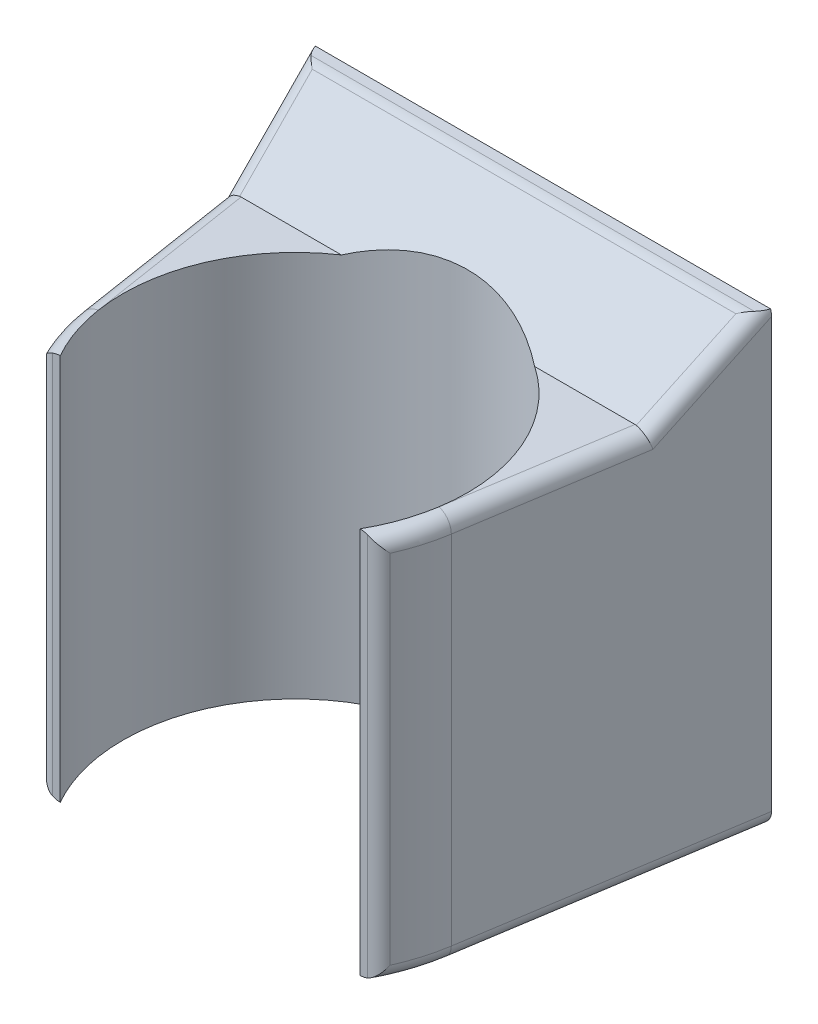
ISO-10303-21;
HEADER;
FILE_DESCRIPTION(('STEP AP214'),'2;1');
FILE_NAME('part.step','',(''),(''),'','','');
FILE_SCHEMA(('AUTOMOTIVE_DESIGN { 1 0 10303 214 1 1 1 1 }'));
ENDSEC;
DATA;
#1=APPLICATION_CONTEXT('core data for automotive mechanical design processes');
#2=APPLICATION_PROTOCOL_DEFINITION('international standard','automotive_design',2000,#1);
#3=PRODUCT_CONTEXT('',#1,'mechanical');
#4=PRODUCT('Part','Part','',(#3));
#5=PRODUCT_RELATED_PRODUCT_CATEGORY('part','',(#4));
#6=PRODUCT_DEFINITION_FORMATION('','',#4);
#7=PRODUCT_DEFINITION_CONTEXT('part definition',#1,'design');
#8=PRODUCT_DEFINITION('design','',#6,#7);
#9=PRODUCT_DEFINITION_SHAPE('','',#8);
#10=(LENGTH_UNIT() NAMED_UNIT(*) SI_UNIT(.MILLI.,.METRE.));
#11=(NAMED_UNIT(*) PLANE_ANGLE_UNIT() SI_UNIT($,.RADIAN.));
#12=(NAMED_UNIT(*) SI_UNIT($,.STERADIAN.) SOLID_ANGLE_UNIT());
#13=UNCERTAINTY_MEASURE_WITH_UNIT(LENGTH_MEASURE(1.E-05),#10,'distance_accuracy_value','');
#14=(GEOMETRIC_REPRESENTATION_CONTEXT(3) GLOBAL_UNCERTAINTY_ASSIGNED_CONTEXT((#13)) GLOBAL_UNIT_ASSIGNED_CONTEXT((#10,
#11,#12)) REPRESENTATION_CONTEXT('',''));
#15=CARTESIAN_POINT('',(0.,0.,0.));
#16=DIRECTION('',(0.,0.,1.));
#17=DIRECTION('',(1.,0.,0.));
#18=AXIS2_PLACEMENT_3D('',#15,#16,#17);
#19=CARTESIAN_POINT('',(11.13552872566,30.,5.67890834580027));
#20=DIRECTION('',(0.,0.,-1.));
#21=DIRECTION('',(-1.,0.,0.));
#22=AXIS2_PLACEMENT_3D('',#19,#20,#21);
#23=PLANE('',#22);
#24=DIRECTION('',(0.,-1.,0.));
#25=VECTOR('',#24,1.);
#26=CARTESIAN_POINT('',(-10.5051328735814,30.,5.67890834580027));
#27=LINE('',#26,#25);
#28=CARTESIAN_POINT('',(-10.5051328735814,25.6970882189264,5.67890834580027));
#29=VERTEX_POINT('',#28);
#30=CARTESIAN_POINT('',(-10.5051328735814,0.102911781073564,5.67890834580027));
#31=VERTEX_POINT('',#30);
#32=EDGE_CURVE('E375',#29,#31,#27,.T.);
#33=ORIENTED_EDGE('',*,*,#32,.T.);
#34=CARTESIAN_POINT('',(-10.5051328735814,0.102911781073565,5.67890834580027));
#35=CARTESIAN_POINT('',(-10.4390562772163,0.0742564835110553,5.67890834580027));
#36=CARTESIAN_POINT('',(-10.3704496172207,0.0516304222241475,5.67890834580027));
#37=CARTESIAN_POINT('',(-10.2315364640359,0.0185988964917889,5.67890834580027));
#38=CARTESIAN_POINT('',(-10.1612766962828,0.00799795207087063,5.67890834580027));
#39=CARTESIAN_POINT('',(-10.0604898680895,0.00103474183191721,5.67890834580027));
#40=CARTESIAN_POINT('',(-10.0302342968207,-4.14489225278887E-06,5.67890834580027));
#41=CARTESIAN_POINT('',(-10.,0.,5.67890834580027));
#42=B_SPLINE_CURVE_WITH_KNOTS('',3,(#34,#35,#36,#37,#38,#39,#40,#41),.UNSPECIFIED.,.F.,.F.,(4,2,
2,4),(0.,0.215695155836073,0.427831340232889,0.518569670833685),.UNSPECIFIED.);
#43=CARTESIAN_POINT('',(-10.,0.,5.67890834580027));
#44=VERTEX_POINT('',#43);
#45=EDGE_CURVE('E244',#31,#44,#42,.T.);
#46=ORIENTED_EDGE('',*,*,#45,.T.);
#47=DIRECTION('',(0.,1.,0.));
#48=VECTOR('',#47,1.);
#49=CARTESIAN_POINT('',(-10.,0.,5.67890834580027));
#50=LINE('',#49,#48);
#51=CARTESIAN_POINT('',(-10.,25.8,5.67890834580027));
#52=VERTEX_POINT('',#51);
#53=EDGE_CURVE('E197',#44,#52,#50,.T.);
#54=ORIENTED_EDGE('',*,*,#53,.T.);
#55=CARTESIAN_POINT('',(-10.,25.8,5.67890834580027));
#56=CARTESIAN_POINT('',(-10.0719015065059,25.8000447911978,5.67890834580027));
#57=CARTESIAN_POINT('',(-10.143973880234,25.7941358505785,5.67890834580027));
#58=CARTESIAN_POINT('',(-10.2848892497754,25.7706065708585,5.67890834580027));
#59=CARTESIAN_POINT('',(-10.3537664870802,25.7531897038123,5.67890834580027));
#60=CARTESIAN_POINT('',(-10.4348306022066,25.725063612592,5.67890834580027));
#61=CARTESIAN_POINT('',(-10.4490047399151,25.7198499770122,5.67890834580027));
#62=CARTESIAN_POINT('',(-10.4772008705726,25.7088765708328,5.67890834580027));
#63=CARTESIAN_POINT('',(-10.4912220987829,25.7031148356164,5.67890834580027));
#64=CARTESIAN_POINT('',(-10.5051328735814,25.6970882189264,5.67890834580027));
#65=B_SPLINE_CURVE_WITH_KNOTS('',3,(#55,#56,#57,#58,#59,#60,#61,#62,#63,#64),.UNSPECIFIED.,.F.,
.F.,(4,2,2,2,4),(0.,0.215773371607439,0.427830227453304,0.473131172926107,0.518601097155922),.UNSPECIFIED.);
#66=EDGE_CURVE('E235',#52,#29,#65,.T.);
#67=ORIENTED_EDGE('',*,*,#66,.T.);
#68=EDGE_LOOP('',(#33,#46,#54,#67));
#69=FACE_BOUND('',#68,.T.);
#70=ADVANCED_FACE('F37',(#69),#23,.F.);
#71=CARTESIAN_POINT('',(0.,25.8,0.));
#72=DIRECTION('',(0.,1.,0.));
#73=DIRECTION('',(0.,0.,1.));
#74=AXIS2_PLACEMENT_3D('',#71,#72,#73);
#75=PLANE('',#74);
#76=CARTESIAN_POINT('',(0.,25.8,0.));
#77=DIRECTION('',(0.,1.,0.));
#78=DIRECTION('',(0.,0.,1.));
#79=AXIS2_PLACEMENT_3D('',#76,#77,#78);
#80=CIRCLE('',#79,11.5);
#81=CARTESIAN_POINT('',(11.3605460844121,25.8,1.78549507530793));
#82=VERTEX_POINT('',#81);
#83=CARTESIAN_POINT('',(6.44708821640747,25.8,-9.52287002588295));
#84=VERTEX_POINT('',#83);
#85=EDGE_CURVE('E344',#82,#84,#80,.T.);
#86=ORIENTED_EDGE('',*,*,#85,.F.);
#87=DIRECTION('',(0.155260441331124,0.,-0.987873572557574));
#88=VECTOR('',#87,1.);
#89=CARTESIAN_POINT('',(13.1622417774943,25.8,-9.67813046721408));
#90=LINE('',#89,#88);
#91=CARTESIAN_POINT('',(13.1378400672836,25.8,-9.52287002588295));
#92=VERTEX_POINT('',#91);
#93=EDGE_CURVE('E204',#82,#92,#90,.T.);
#94=ORIENTED_EDGE('',*,*,#93,.T.);
#95=DIRECTION('',(-1.,0.,0.));
#96=VECTOR('',#95,1.);
#97=CARTESIAN_POINT('',(-14.1498358499417,25.8,-9.52287002588295));
#98=LINE('',#97,#96);
#99=EDGE_CURVE('E365',#92,#84,#98,.T.);
#100=ORIENTED_EDGE('',*,*,#99,.T.);
#101=EDGE_LOOP('',(#86,#94,#100));
#102=FACE_BOUND('',#101,.T.);
#103=ADVANCED_FACE('F420',(#102),#75,.T.);
#104=CARTESIAN_POINT('',(0.,30.,0.));
#105=DIRECTION('',(0.,-1.,0.));
#106=DIRECTION('',(0.,0.,-1.));
#107=AXIS2_PLACEMENT_3D('',#104,#105,#106);
#108=CYLINDRICAL_SURFACE('',#107,12.5);
#109=DIRECTION('',(0.,-1.,0.));
#110=VECTOR('',#109,1.);
#111=CARTESIAN_POINT('',(-12.3484196569697,30.,1.94075551663905));
#112=LINE('',#111,#110);
#113=CARTESIAN_POINT('',(-12.3484196569697,24.8,1.94075551663905));
#114=VERTEX_POINT('',#113);
#115=CARTESIAN_POINT('',(-12.3484196569697,1.,1.94075551663905));
#116=VERTEX_POINT('',#115);
#117=EDGE_CURVE('E361',#114,#116,#112,.T.);
#118=ORIENTED_EDGE('',*,*,#117,.T.);
#119=CARTESIAN_POINT('',(0.,1.,0.));
#120=DIRECTION('',(0.,1.,0.));
#121=DIRECTION('',(0.,0.,1.));
#122=AXIS2_PLACEMENT_3D('',#119,#120,#121);
#123=CIRCLE('',#122,12.5);
#124=CARTESIAN_POINT('',(-11.4186226886754,1.,5.08576994108725));
#125=VERTEX_POINT('',#124);
#126=EDGE_CURVE('E373',#116,#125,#123,.T.);
#127=ORIENTED_EDGE('',*,*,#126,.T.);
#128=DIRECTION('',(0.,-1.,0.));
#129=VECTOR('',#128,1.);
#130=CARTESIAN_POINT('',(-11.4186226886754,30.,5.08576994108725));
#131=LINE('',#130,#129);
#132=CARTESIAN_POINT('',(-11.4186226886754,24.8,5.08576994108725));
#133=VERTEX_POINT('',#132);
#134=EDGE_CURVE('E369',#125,#133,#131,.F.);
#135=ORIENTED_EDGE('',*,*,#134,.T.);
#136=CARTESIAN_POINT('',(0.,24.8,0.));
#137=DIRECTION('',(0.,1.,0.));
#138=DIRECTION('',(0.,0.,1.));
#139=AXIS2_PLACEMENT_3D('',#136,#137,#138);
#140=CIRCLE('',#139,12.5);
#141=EDGE_CURVE('E371',#133,#114,#140,.F.);
#142=ORIENTED_EDGE('',*,*,#141,.T.);
#143=EDGE_LOOP('',(#118,#127,#135,#142));
#144=FACE_BOUND('',#143,.T.);
#145=ADVANCED_FACE('F229',(#144),#108,.T.);
#146=DIRECTION('',(0.,1.,0.));
#147=VECTOR('',#146,1.);
#148=CARTESIAN_POINT('',(10.,0.,5.67890834580027));
#149=LINE('',#148,#147);
#150=CARTESIAN_POINT('',(10.,0.,5.67890834580027));
#151=VERTEX_POINT('',#150);
#152=CARTESIAN_POINT('',(10.,25.8,5.67890834580027));
#153=VERTEX_POINT('',#152);
#154=EDGE_CURVE('E181',#151,#153,#149,.T.);
#155=ORIENTED_EDGE('',*,*,#154,.F.);
#156=CARTESIAN_POINT('',(10.,0.,5.67890834580027));
#157=CARTESIAN_POINT('',(10.0719015065059,-4.47911978014021E-05,5.67890834580027));
#158=CARTESIAN_POINT('',(10.143973880234,0.00586414942147235,5.67890834580027));
#159=CARTESIAN_POINT('',(10.2848892497754,0.0293934291414904,5.67890834580027));
#160=CARTESIAN_POINT('',(10.3537664870802,0.0468102961877393,5.67890834580027));
#161=CARTESIAN_POINT('',(10.4348306022066,0.0749363874080327,5.67890834580027));
#162=CARTESIAN_POINT('',(10.4490047399151,0.080150022987751,5.67890834580027));
#163=CARTESIAN_POINT('',(10.4772008705726,0.0911234291672142,5.67890834580027));
#164=CARTESIAN_POINT('',(10.4912220987829,0.0968851643835558,5.67890834580027));
#165=CARTESIAN_POINT('',(10.5051328735814,0.102911781073566,5.67890834580027));
#166=B_SPLINE_CURVE_WITH_KNOTS('',3,(#156,#157,#158,#159,#160,#161,#162,#163,#164,#165),
.UNSPECIFIED.,.F.,.F.,(4,2,2,2,4),(0.,0.215773371607442,0.427830227453304,0.473131172926107,
0.518601097155923),.UNSPECIFIED.);
#167=CARTESIAN_POINT('',(10.5051328735814,0.102911781073564,5.67890834580027));
#168=VERTEX_POINT('',#167);
#169=EDGE_CURVE('E193',#151,#168,#166,.T.);
#170=ORIENTED_EDGE('',*,*,#169,.T.);
#171=DIRECTION('',(0.,-1.,0.));
#172=VECTOR('',#171,1.);
#173=CARTESIAN_POINT('',(10.5051328735814,30.,5.67890834580027));
#174=LINE('',#173,#172);
#175=CARTESIAN_POINT('',(10.5051328735814,25.6970882189264,5.67890834580027));
#176=VERTEX_POINT('',#175);
#177=EDGE_CURVE('E208',#168,#176,#174,.F.);
#178=ORIENTED_EDGE('',*,*,#177,.T.);
#179=CARTESIAN_POINT('',(10.5051328735814,25.6970882189264,5.67890834580027));
#180=CARTESIAN_POINT('',(10.4390562772163,25.7257435164889,5.67890834580027));
#181=CARTESIAN_POINT('',(10.3704496172207,25.7483695777759,5.67890834580027));
#182=CARTESIAN_POINT('',(10.2315364640359,25.7814011035082,5.67890834580027));
#183=CARTESIAN_POINT('',(10.1612766962828,25.7920020479291,5.67890834580027));
#184=CARTESIAN_POINT('',(10.0604898680895,25.7989652581681,5.67890834580027));
#185=CARTESIAN_POINT('',(10.0302342968207,25.8000041448923,5.67890834580027));
#186=CARTESIAN_POINT('',(10.,25.8,5.67890834580027));
#187=B_SPLINE_CURVE_WITH_KNOTS('',3,(#179,#180,#181,#182,#183,#184,#185,#186),.UNSPECIFIED.,.F.,
.F.,(4,2,2,4),(0.,0.215695155836076,0.427831340232892,0.518569670833681),.UNSPECIFIED.);
#188=EDGE_CURVE('E196',#176,#153,#187,.T.);
#189=ORIENTED_EDGE('',*,*,#188,.T.);
#190=EDGE_LOOP('',(#155,#170,#178,#189));
#191=FACE_BOUND('',#190,.T.);
#192=ADVANCED_FACE('F192',(#191),#23,.F.);
#193=CARTESIAN_POINT('',(0.,30.,0.));
#194=DIRECTION('',(0.,-1.,0.));
#195=DIRECTION('',(0.,0.,-1.));
#196=AXIS2_PLACEMENT_3D('',#193,#194,#195);
#197=CYLINDRICAL_SURFACE('',#196,12.5);
#198=DIRECTION('',(0.,-1.,0.));
#199=VECTOR('',#198,1.);
#200=CARTESIAN_POINT('',(11.4186226886754,30.,5.08576994108725));
#201=LINE('',#200,#199);
#202=CARTESIAN_POINT('',(11.4186226886754,24.8,5.08576994108725));
#203=VERTEX_POINT('',#202);
#204=CARTESIAN_POINT('',(11.4186226886754,1.,5.08576994108725));
#205=VERTEX_POINT('',#204);
#206=EDGE_CURVE('E405',#203,#205,#201,.T.);
#207=ORIENTED_EDGE('',*,*,#206,.T.);
#208=CARTESIAN_POINT('',(0.,1.,0.));
#209=DIRECTION('',(0.,1.,0.));
#210=DIRECTION('',(0.,0.,1.));
#211=AXIS2_PLACEMENT_3D('',#208,#209,#210);
#212=CIRCLE('',#211,12.5);
#213=CARTESIAN_POINT('',(12.3484196569697,1.,1.94075551663905));
#214=VERTEX_POINT('',#213);
#215=EDGE_CURVE('E412',#205,#214,#212,.T.);
#216=ORIENTED_EDGE('',*,*,#215,.T.);
#217=DIRECTION('',(0.,-1.,0.));
#218=VECTOR('',#217,1.);
#219=CARTESIAN_POINT('',(12.3484196569697,30.,1.94075551663905));
#220=LINE('',#219,#218);
#221=CARTESIAN_POINT('',(12.3484196569697,24.8,1.94075551663905));
#222=VERTEX_POINT('',#221);
#223=EDGE_CURVE('E358',#222,#214,#220,.T.);
#224=ORIENTED_EDGE('',*,*,#223,.F.);
#225=CARTESIAN_POINT('',(0.,24.8,0.));
#226=DIRECTION('',(0.,1.,0.));
#227=DIRECTION('',(0.,0.,1.));
#228=AXIS2_PLACEMENT_3D('',#225,#226,#227);
#229=CIRCLE('',#228,12.5);
#230=EDGE_CURVE('E408',#222,#203,#229,.F.);
#231=ORIENTED_EDGE('',*,*,#230,.T.);
#232=EDGE_LOOP('',(#207,#216,#224,#231));
#233=FACE_BOUND('',#232,.T.);
#234=ADVANCED_FACE('F228',(#233),#197,.T.);
#235=CARTESIAN_POINT('',(-15.25,30.,-16.5210916541997));
#236=DIRECTION('',(0.987873572557574,0.,-0.155260441331124));
#237=DIRECTION('',(-0.155260441331124,0.,-0.987873572557574));
#238=AXIS2_PLACEMENT_3D('',#235,#236,#237);
#239=PLANE('',#238);
#240=DIRECTION('',(0.,-1.,0.));
#241=VECTOR('',#240,1.);
#242=CARTESIAN_POINT('',(-15.25,30.,-16.5210916541997));
#243=LINE('',#242,#241);
#244=CARTESIAN_POINT('',(-15.25,29.5881474808541,-16.5210916541997));
#245=VERTEX_POINT('',#244);
#246=CARTESIAN_POINT('',(-15.25,1.,-16.5210916541997));
#247=VERTEX_POINT('',#246);
#248=EDGE_CURVE('E349',#245,#247,#243,.T.);
#249=ORIENTED_EDGE('',*,*,#248,.T.);
#250=DIRECTION('',(0.155260441331124,0.,0.987873572557574));
#251=VECTOR('',#250,1.);
#252=CARTESIAN_POINT('',(-15.25,1.,-16.5210916541997));
#253=LINE('',#252,#251);
#254=EDGE_CURVE('E503',#247,#116,#253,.T.);
#255=ORIENTED_EDGE('',*,*,#254,.T.);
#256=ORIENTED_EDGE('',*,*,#117,.F.);
#257=DIRECTION('',(0.155260441331124,0.,0.987873572557574));
#258=VECTOR('',#257,1.);
#259=CARTESIAN_POINT('',(-14.1501153500519,24.8,-9.52287002588296));
#260=LINE('',#259,#258);
#261=CARTESIAN_POINT('',(-14.1752679861386,24.8,-9.68290837343081));
#262=VERTEX_POINT('',#261);
#263=EDGE_CURVE('E505',#114,#262,#260,.F.);
#264=ORIENTED_EDGE('',*,*,#263,.T.);
#265=DIRECTION('',(-0.127689239805196,0.568881269023259,-0.812446650428481));
#266=VECTOR('',#265,1.);
#267=CARTESIAN_POINT('',(-15.1736137540766,29.247831377609,-16.0350698896881));
#268=LINE('',#267,#266);
#269=EDGE_CURVE('E206',#262,#245,#268,.T.);
#270=ORIENTED_EDGE('',*,*,#269,.T.);
#271=EDGE_LOOP('',(#249,#255,#256,#264,#270));
#272=FACE_BOUND('',#271,.T.);
#273=ADVANCED_FACE('F449',(#272),#239,.F.);
#274=CARTESIAN_POINT('',(12.3484196569697,30.,1.94075551663905));
#275=DIRECTION('',(-0.987873572557574,0.,-0.155260441331124));
#276=DIRECTION('',(-0.155260441331124,0.,0.987873572557574));
#277=AXIS2_PLACEMENT_3D('',#274,#275,#276);
#278=PLANE('',#277);
#279=ORIENTED_EDGE('',*,*,#223,.T.);
#280=DIRECTION('',(0.155260441331124,0.,-0.987873572557574));
#281=VECTOR('',#280,1.);
#282=CARTESIAN_POINT('',(12.3484196569697,1.,1.94075551663905));
#283=LINE('',#282,#281);
#284=CARTESIAN_POINT('',(15.25,1.,-16.5210916541997));
#285=VERTEX_POINT('',#284);
#286=EDGE_CURVE('E458',#214,#285,#283,.T.);
#287=ORIENTED_EDGE('',*,*,#286,.T.);
#288=DIRECTION('',(0.,-1.,0.));
#289=VECTOR('',#288,1.);
#290=CARTESIAN_POINT('',(15.25,30.,-16.5210916541997));
#291=LINE('',#290,#289);
#292=CARTESIAN_POINT('',(15.25,29.5881474808541,-16.5210916541997));
#293=VERTEX_POINT('',#292);
#294=EDGE_CURVE('E355',#293,#285,#291,.T.);
#295=ORIENTED_EDGE('',*,*,#294,.F.);
#296=DIRECTION('',(-0.127689239805196,-0.568881269023259,0.812446650428481));
#297=VECTOR('',#296,1.);
#298=CARTESIAN_POINT('',(14.2308954112797,25.047831377609,-10.0368482613713));
#299=LINE('',#298,#297);
#300=CARTESIAN_POINT('',(14.1752679861386,24.8,-9.68290837343082));
#301=VERTEX_POINT('',#300);
#302=EDGE_CURVE('E469',#293,#301,#299,.T.);
#303=ORIENTED_EDGE('',*,*,#302,.T.);
#304=DIRECTION('',(0.155260441331124,0.,-0.987873572557574));
#305=VECTOR('',#304,1.);
#306=CARTESIAN_POINT('',(12.3484196569697,24.8,1.94075551663906));
#307=LINE('',#306,#305);
#308=EDGE_CURVE('E459',#301,#222,#307,.F.);
#309=ORIENTED_EDGE('',*,*,#308,.T.);
#310=EDGE_LOOP('',(#279,#287,#295,#303,#309));
#311=FACE_BOUND('',#310,.T.);
#312=ADVANCED_FACE('F446',(#311),#278,.F.);
#313=CARTESIAN_POINT('',(15.25,30.,-16.5210916541997));
#314=DIRECTION('',(0.,0.,1.));
#315=DIRECTION('',(1.,0.,0.));
#316=AXIS2_PLACEMENT_3D('',#313,#314,#315);
#317=PLANE('',#316);
#318=DIRECTION('',(-1.,0.,0.));
#319=VECTOR('',#318,1.);
#320=CARTESIAN_POINT('',(15.25,0.,-16.5210916541997));
#321=LINE('',#320,#319);
#322=CARTESIAN_POINT('',(14.2377247172317,0.,-16.5210916541997));
#323=VERTEX_POINT('',#322);
#324=CARTESIAN_POINT('',(-14.2377247172317,0.,-16.5210916541997));
#325=VERTEX_POINT('',#324);
#326=EDGE_CURVE('E350',#323,#325,#321,.T.);
#327=ORIENTED_EDGE('',*,*,#326,.T.);
#328=CARTESIAN_POINT('',(-14.2377247172317,1.,-16.5210916541997));
#329=DIRECTION('',(0.,0.,1.));
#330=DIRECTION('',(1.,0.,0.));
#331=AXIS2_PLACEMENT_3D('',#328,#329,#330);
#332=ELLIPSE('',#331,1.01227528276825,1.);
#333=EDGE_CURVE('E496',#325,#247,#332,.F.);
#334=ORIENTED_EDGE('',*,*,#333,.T.);
#335=ORIENTED_EDGE('',*,*,#248,.F.);
#336=CARTESIAN_POINT('',(-14.2377247172317,29.4794329494482,-16.5210916541997));
#337=DIRECTION('',(0.,0.,1.));
#338=DIRECTION('',(0.219007643917953,-0.975723143061343,0.));
#339=AXIS2_PLACEMENT_3D('',#336,#337,#338);
#340=ELLIPSE('',#339,1.230850049628,1.);
#341=CARTESIAN_POINT('',(-15.1881544119727,30.,-16.5210916541997));
#342=VERTEX_POINT('',#341);
#343=EDGE_CURVE('E500',#245,#342,#340,.F.);
#344=ORIENTED_EDGE('',*,*,#343,.T.);
#345=DIRECTION('',(-1.,0.,0.));
#346=VECTOR('',#345,1.);
#347=CARTESIAN_POINT('',(15.25,30.,-16.5210916541997));
#348=LINE('',#347,#346);
#349=CARTESIAN_POINT('',(15.1881544119727,30.,-16.5210916541997));
#350=VERTEX_POINT('',#349);
#351=EDGE_CURVE('E346',#350,#342,#348,.T.);
#352=ORIENTED_EDGE('',*,*,#351,.F.);
#353=CARTESIAN_POINT('',(14.2377247172317,29.4794329494482,-16.5210916541997));
#354=DIRECTION('',(0.,0.,1.));
#355=DIRECTION('',(0.219007643917953,0.975723143061343,0.));
#356=AXIS2_PLACEMENT_3D('',#353,#354,#355);
#357=ELLIPSE('',#356,1.230850049628,1.);
#358=EDGE_CURVE('E495',#350,#293,#357,.F.);
#359=ORIENTED_EDGE('',*,*,#358,.T.);
#360=ORIENTED_EDGE('',*,*,#294,.T.);
#361=CARTESIAN_POINT('',(14.2377247172317,1.,-16.5210916541997));
#362=DIRECTION('',(0.,0.,1.));
#363=DIRECTION('',(1.,0.,0.));
#364=AXIS2_PLACEMENT_3D('',#361,#362,#363);
#365=ELLIPSE('',#364,1.01227528276825,1.);
#366=EDGE_CURVE('E464',#285,#323,#365,.F.);
#367=ORIENTED_EDGE('',*,*,#366,.T.);
#368=EDGE_LOOP('',(#327,#334,#335,#344,#352,#359,#360,#367));
#369=FACE_BOUND('',#368,.T.);
#370=ADVANCED_FACE('F442',(#369),#317,.F.);
#371=CARTESIAN_POINT('',(0.,30.,0.));
#372=DIRECTION('',(0.,1.,0.));
#373=DIRECTION('',(0.,0.,1.));
#374=AXIS2_PLACEMENT_3D('',#371,#372,#373);
#375=PLANE('',#374);
#376=ORIENTED_EDGE('',*,*,#351,.T.);
#377=CARTESIAN_POINT('',(-14.3545695046629,30.,-17.2645384498208));
#378=DIRECTION('',(0.,1.,0.));
#379=DIRECTION('',(0.155260441331124,0.,0.987873572557574));
#380=AXIS2_PLACEMENT_3D('',#377,#378,#379);
#381=ELLIPSE('',#380,1.75783604497464,1.);
#382=CARTESIAN_POINT('',(-14.7822671203758,30.,-15.8363904430787));
#383=VERTEX_POINT('',#382);
#384=EDGE_CURVE('E474',#342,#383,#381,.T.);
#385=ORIENTED_EDGE('',*,*,#384,.T.);
#386=DIRECTION('',(1.,0.,0.));
#387=VECTOR('',#386,1.);
#388=CARTESIAN_POINT('',(0.,30.,-15.8363904430787));
#389=LINE('',#388,#387);
#390=CARTESIAN_POINT('',(14.7822671203758,30.,-15.8363904430787));
#391=VERTEX_POINT('',#390);
#392=EDGE_CURVE('E465',#383,#391,#389,.T.);
#393=ORIENTED_EDGE('',*,*,#392,.T.);
#394=CARTESIAN_POINT('',(14.3545695046629,30.,-17.2645384498208));
#395=DIRECTION('',(0.,1.,0.));
#396=DIRECTION('',(0.155260441331124,0.,-0.987873572557574));
#397=AXIS2_PLACEMENT_3D('',#394,#395,#396);
#398=ELLIPSE('',#397,1.75783604497464,1.);
#399=EDGE_CURVE('E467',#391,#350,#398,.T.);
#400=ORIENTED_EDGE('',*,*,#399,.T.);
#401=EDGE_LOOP('',(#376,#385,#393,#400));
#402=FACE_BOUND('',#401,.T.);
#403=ADVANCED_FACE('F436',(#402),#375,.T.);
#404=CARTESIAN_POINT('',(0.,0.,0.));
#405=DIRECTION('',(0.,1.,0.));
#406=DIRECTION('',(0.,0.,1.));
#407=AXIS2_PLACEMENT_3D('',#404,#405,#406);
#408=PLANE('',#407);
#409=CARTESIAN_POINT('',(0.,0.,0.));
#410=DIRECTION('',(0.,1.,0.));
#411=DIRECTION('',(0.,0.,1.));
#412=AXIS2_PLACEMENT_3D('',#409,#410,#411);
#413=CIRCLE('',#412,11.5);
#414=CARTESIAN_POINT('',(11.3605460844121,0.,1.78549507530793));
#415=VERTEX_POINT('',#414);
#416=CARTESIAN_POINT('',(-11.3605460844121,0.,1.78549507530793));
#417=VERTEX_POINT('',#416);
#418=EDGE_CURVE('E184',#415,#417,#413,.T.);
#419=ORIENTED_EDGE('',*,*,#418,.T.);
#420=DIRECTION('',(0.155260441331124,0.,0.987873572557574));
#421=VECTOR('',#420,1.);
#422=CARTESIAN_POINT('',(-11.3605460844121,0.,1.78549507530793));
#423=LINE('',#422,#421);
#424=EDGE_CURVE('E406',#417,#325,#423,.F.);
#425=ORIENTED_EDGE('',*,*,#424,.T.);
#426=ORIENTED_EDGE('',*,*,#326,.F.);
#427=DIRECTION('',(0.155260441331124,0.,-0.987873572557574));
#428=VECTOR('',#427,1.);
#429=CARTESIAN_POINT('',(11.3605460844121,0.,1.78549507530793));
#430=LINE('',#429,#428);
#431=EDGE_CURVE('E251',#323,#415,#430,.F.);
#432=ORIENTED_EDGE('',*,*,#431,.T.);
#433=EDGE_LOOP('',(#419,#425,#426,#432));
#434=FACE_BOUND('',#433,.T.);
#435=ADVANCED_FACE('F431',(#434),#408,.F.);
#436=CARTESIAN_POINT('',(-6.44708821640747,25.8,-9.52287002588295));
#437=VERTEX_POINT('',#436);
#438=CARTESIAN_POINT('',(-13.1378400672836,25.8,-9.52287002588295));
#439=VERTEX_POINT('',#438);
#440=EDGE_CURVE('E364',#437,#439,#98,.T.);
#441=ORIENTED_EDGE('',*,*,#440,.T.);
#442=DIRECTION('',(0.155260441331124,0.,0.987873572557574));
#443=VECTOR('',#442,1.);
#444=CARTESIAN_POINT('',(-11.3605460844121,25.8,1.78549507530793));
#445=LINE('',#444,#443);
#446=CARTESIAN_POINT('',(-11.3605460844121,25.8,1.78549507530793));
#447=VERTEX_POINT('',#446);
#448=EDGE_CURVE('E402',#439,#447,#445,.T.);
#449=ORIENTED_EDGE('',*,*,#448,.T.);
#450=EDGE_CURVE('E341',#437,#447,#80,.T.);
#451=ORIENTED_EDGE('',*,*,#450,.F.);
#452=EDGE_LOOP('',(#441,#449,#451));
#453=FACE_BOUND('',#452,.T.);
#454=ADVANCED_FACE('F401',(#453),#75,.T.);
#455=CARTESIAN_POINT('',(-14.1498358499417,25.7987547707417,-9.52109165419972));
#456=DIRECTION('',(0.,0.819152044288988,0.573576436351051));
#457=DIRECTION('',(1.,0.,0.));
#458=AXIS2_PLACEMENT_3D('',#455,#456,#457);
#459=PLANE('',#458);
#460=DIRECTION('',(1.,0.,0.));
#461=VECTOR('',#460,1.);
#462=CARTESIAN_POINT('',(-14.1498358499417,29.819152044289,-15.2628140067277));
#463=LINE('',#462,#461);
#464=CARTESIAN_POINT('',(14.1301127563779,29.819152044289,-15.2628140067277));
#465=VERTEX_POINT('',#464);
#466=CARTESIAN_POINT('',(-14.1301127563779,29.819152044289,-15.2628140067277));
#467=VERTEX_POINT('',#466);
#468=EDGE_CURVE('E476',#465,#467,#463,.F.);
#469=ORIENTED_EDGE('',*,*,#468,.T.);
#470=DIRECTION('',(-0.127689239805196,0.568881269023259,-0.812446650428481));
#471=VECTOR('',#470,1.);
#472=CARTESIAN_POINT('',(-13.2430218387221,25.866983421898,-9.61853226635138));
#473=LINE('',#472,#471);
#474=CARTESIAN_POINT('',(-13.2270951513681,25.7960268234632,-9.5171957417315));
#475=VERTEX_POINT('',#474);
#476=EDGE_CURVE('E61',#467,#475,#473,.F.);
#477=ORIENTED_EDGE('',*,*,#476,.T.);
#478=CARTESIAN_POINT('',(-12.9133833189986,24.8,-8.09472201914086));
#479=DIRECTION('',(0.,0.819152044288988,0.573576436351051));
#480=DIRECTION('',(-0.188427772461333,0.563301990555499,-0.80447861500569));
#481=AXIS2_PLACEMENT_3D('',#478,#479,#480);
#482=ELLIPSE('',#481,1.76484809802873,1.);
#483=EDGE_CURVE('E46',#475,#439,#482,.F.);
#484=ORIENTED_EDGE('',*,*,#483,.T.);
#485=ORIENTED_EDGE('',*,*,#440,.F.);
#486=CARTESIAN_POINT('',(0.,19.1320146224854,0.));
#487=DIRECTION('',(0.,0.819152044288988,0.573576436351051));
#488=DIRECTION('',(0.,0.573576436351051,-0.819152044288988));
#489=AXIS2_PLACEMENT_3D('',#486,#487,#488);
#490=ELLIPSE('',#489,14.0389077707568,11.5);
#491=EDGE_CURVE('E367',#84,#437,#490,.T.);
#492=ORIENTED_EDGE('',*,*,#491,.F.);
#493=ORIENTED_EDGE('',*,*,#99,.F.);
#494=CARTESIAN_POINT('',(12.9133833189986,24.8,-8.09472201914086));
#495=DIRECTION('',(0.,0.819152044288988,0.573576436351051));
#496=DIRECTION('',(-0.188427772461333,-0.563301990555499,0.80447861500569));
#497=AXIS2_PLACEMENT_3D('',#494,#495,#496);
#498=ELLIPSE('',#497,1.76484809802873,1.);
#499=CARTESIAN_POINT('',(13.2270951513681,25.7960268234632,-9.5171957417315));
#500=VERTEX_POINT('',#499);
#501=EDGE_CURVE('E11',#92,#500,#498,.F.);
#502=ORIENTED_EDGE('',*,*,#501,.T.);
#503=DIRECTION('',(-0.127689239805196,-0.568881269023259,0.812446650428481));
#504=VECTOR('',#503,1.);
#505=CARTESIAN_POINT('',(14.185740181519,30.066983421898,-15.6167538946682));
#506=LINE('',#505,#504);
#507=EDGE_CURVE('E54',#500,#465,#506,.F.);
#508=ORIENTED_EDGE('',*,*,#507,.T.);
#509=EDGE_LOOP('',(#469,#477,#484,#485,#492,#493,#502,#508));
#510=FACE_BOUND('',#509,.T.);
#511=ADVANCED_FACE('F261',(#510),#459,.T.);
#512=CARTESIAN_POINT('',(0.,0.,0.));
#513=DIRECTION('',(0.,1.,0.));
#514=DIRECTION('',(0.,0.,1.));
#515=AXIS2_PLACEMENT_3D('',#512,#513,#514);
#516=CYLINDRICAL_SURFACE('',#515,11.5);
#517=EDGE_CURVE('E345',#153,#82,#80,.T.);
#518=ORIENTED_EDGE('',*,*,#517,.T.);
#519=ORIENTED_EDGE('',*,*,#85,.T.);
#520=ORIENTED_EDGE('',*,*,#491,.T.);
#521=ORIENTED_EDGE('',*,*,#450,.T.);
#522=EDGE_CURVE('E339',#447,#52,#80,.T.);
#523=ORIENTED_EDGE('',*,*,#522,.T.);
#524=ORIENTED_EDGE('',*,*,#53,.F.);
#525=EDGE_CURVE('E190',#417,#44,#413,.T.);
#526=ORIENTED_EDGE('',*,*,#525,.F.);
#527=ORIENTED_EDGE('',*,*,#418,.F.);
#528=EDGE_CURVE('E177',#151,#415,#413,.T.);
#529=ORIENTED_EDGE('',*,*,#528,.F.);
#530=ORIENTED_EDGE('',*,*,#154,.T.);
#531=EDGE_LOOP('',(#518,#519,#520,#521,#523,#524,#526,#527,#529,#530));
#532=FACE_BOUND('',#531,.T.);
#533=ADVANCED_FACE('F180',(#532),#516,.F.);
#534=CARTESIAN_POINT('',(11.3605460844121,1.,1.78549507530793));
#535=DIRECTION('',(0.155260441331124,0.,-0.987873572557574));
#536=DIRECTION('',(-0.987873572557574,0.,-0.155260441331124));
#537=AXIS2_PLACEMENT_3D('',#534,#535,#536);
#538=CYLINDRICAL_SURFACE('',#537,1.);
#539=ORIENTED_EDGE('',*,*,#366,.F.);
#540=ORIENTED_EDGE('',*,*,#286,.F.);
#541=CARTESIAN_POINT('',(11.3605460844121,1.,1.78549507530793));
#542=DIRECTION('',(-0.155260441331124,0.,0.987873572557574));
#543=DIRECTION('',(0.987873572557574,0.,0.155260441331124));
#544=AXIS2_PLACEMENT_3D('',#541,#542,#543);
#545=CIRCLE('',#544,1.);
#546=EDGE_CURVE('E41',#415,#214,#545,.T.);
#547=ORIENTED_EDGE('',*,*,#546,.F.);
#548=ORIENTED_EDGE('',*,*,#431,.F.);
#549=EDGE_LOOP('',(#539,#540,#547,#548));
#550=FACE_BOUND('',#549,.T.);
#551=ADVANCED_FACE('F39',(#550),#538,.T.);
#552=CARTESIAN_POINT('',(0.,1.,0.));
#553=DIRECTION('',(0.,1.,0.));
#554=DIRECTION('',(0.,0.,1.));
#555=AXIS2_PLACEMENT_3D('',#552,#553,#554);
#556=TOROIDAL_SURFACE('',#555,11.5,1.);
#557=ORIENTED_EDGE('',*,*,#546,.T.);
#558=ORIENTED_EDGE('',*,*,#215,.F.);
#559=CARTESIAN_POINT('',(10.5051328735814,0.102911781073565,5.67890834580027));
#560=CARTESIAN_POINT('',(10.5654049857106,0.129076603213814,5.67886544083597));
#561=CARTESIAN_POINT('',(10.6236603788942,0.1588708548199,5.67347257460212));
#562=CARTESIAN_POINT('',(10.734911114821,0.223652167555898,5.65378137587901));
#563=CARTESIAN_POINT('',(10.7879509411391,0.258587525755376,5.63956763497501));
#564=CARTESIAN_POINT('',(10.9024648678846,0.342188779692016,5.59910263469272));
#565=CARTESIAN_POINT('',(10.96228719235,0.391999069119049,5.57062419214997));
#566=CARTESIAN_POINT('',(11.0731769980846,0.495597619221038,5.50444852735173));
#567=CARTESIAN_POINT('',(11.1241974441104,0.54940517878754,5.46670423983608));
#568=CARTESIAN_POINT('',(11.2241146280502,0.667691425074276,5.37762622572654));
#569=CARTESIAN_POINT('',(11.2714929249177,0.732543482163763,5.32509696582693));
#570=CARTESIAN_POINT('',(11.3536166118383,0.86344039890674,5.21266871659673));
#571=CARTESIAN_POINT('',(11.3884006586253,0.929480944101911,5.15279304706958));
#572=CARTESIAN_POINT('',(11.4173285120917,0.996957145094355,5.08866635517666));
#573=CARTESIAN_POINT('',(11.4179773340087,0.998478600173578,5.08721888872515));
#574=CARTESIAN_POINT('',(11.4186226886754,1.,5.08576994108725));
#575=B_SPLINE_CURVE_WITH_KNOTS('',3,(#559,#560,#561,#562,#563,#564,#565,#566,#567,#568,#569,
#570,#571,#572,#573,#574),.UNSPECIFIED.,.F.,.F.,(4,2,2,2,2,2,2,4),(0.,0.196186205456592,
0.390519467715545,0.63791827785668,0.886600724389066,1.17332003127496,1.45915166946451,
1.46574548391983),.UNSPECIFIED.);
#576=EDGE_CURVE('E202',#168,#205,#575,.T.);
#577=ORIENTED_EDGE('',*,*,#576,.F.);
#578=ORIENTED_EDGE('',*,*,#169,.F.);
#579=ORIENTED_EDGE('',*,*,#528,.T.);
#580=EDGE_LOOP('',(#557,#558,#577,#578,#579));
#581=FACE_BOUND('',#580,.T.);
#582=ADVANCED_FACE('F199',(#581),#556,.T.);
#583=CARTESIAN_POINT('',(10.5051328735814,30.,4.67890834580027));
#584=DIRECTION('',(0.,-1.,0.));
#585=DIRECTION('',(0.,0.,-1.));
#586=AXIS2_PLACEMENT_3D('',#583,#584,#585);
#587=CYLINDRICAL_SURFACE('',#586,1.);
#588=ORIENTED_EDGE('',*,*,#576,.T.);
#589=ORIENTED_EDGE('',*,*,#206,.F.);
#590=CARTESIAN_POINT('',(10.5051328735814,25.6970882189264,5.67890834580027));
#591=CARTESIAN_POINT('',(10.5654049857106,25.6709233967862,5.67886544083597));
#592=CARTESIAN_POINT('',(10.6236603788942,25.6411291451801,5.67347257460212));
#593=CARTESIAN_POINT('',(10.734911114821,25.5763478324441,5.65378137587901));
#594=CARTESIAN_POINT('',(10.7879509411391,25.5414124742446,5.63956763497501));
#595=CARTESIAN_POINT('',(10.9024648678846,25.457811220308,5.59910263469273));
#596=CARTESIAN_POINT('',(10.96228719235,25.4080009308809,5.57062419215));
#597=CARTESIAN_POINT('',(11.0731769980846,25.304402380779,5.5044485273517));
#598=CARTESIAN_POINT('',(11.1241974441105,25.2505948212126,5.46670423983596));
#599=CARTESIAN_POINT('',(11.2241146280502,25.1323085749256,5.37762622572668));
#600=CARTESIAN_POINT('',(11.2714929249174,25.0674565178356,5.32509696582749));
#601=CARTESIAN_POINT('',(11.3536166118386,24.9365596010939,5.21266871659617));
#602=CARTESIAN_POINT('',(11.3884006586262,24.8705190559005,5.15279304706747));
#603=CARTESIAN_POINT('',(11.4173285120917,24.8030428549058,5.08866635517657));
#604=CARTESIAN_POINT('',(11.4179773340087,24.8015213998265,5.0872188887251));
#605=CARTESIAN_POINT('',(11.4186226886754,24.8,5.08576994108725));
#606=B_SPLINE_CURVE_WITH_KNOTS('',3,(#590,#591,#592,#593,#594,#595,#596,#597,#598,#599,#600,
#601,#602,#603,#604,#605),.UNSPECIFIED.,.F.,.F.,(4,2,2,2,2,2,2,4),(0.,0.196186205456582,
0.390519467715546,0.637918277856686,0.886600724389064,1.17332003127496,1.45915166946451,
1.46574548391983),.UNSPECIFIED.);
#607=EDGE_CURVE('E320',#176,#203,#606,.T.);
#608=ORIENTED_EDGE('',*,*,#607,.F.);
#609=ORIENTED_EDGE('',*,*,#177,.F.);
#610=EDGE_LOOP('',(#588,#589,#608,#609));
#611=FACE_BOUND('',#610,.T.);
#612=ADVANCED_FACE('F315',(#611),#587,.T.);
#613=CARTESIAN_POINT('',(0.,24.8,0.));
#614=DIRECTION('',(0.,1.,0.));
#615=DIRECTION('',(0.,0.,1.));
#616=AXIS2_PLACEMENT_3D('',#613,#614,#615);
#617=TOROIDAL_SURFACE('',#616,11.5,1.);
#618=ORIENTED_EDGE('',*,*,#607,.T.);
#619=ORIENTED_EDGE('',*,*,#230,.F.);
#620=CARTESIAN_POINT('',(11.3605460844121,24.8,1.78549507530793));
#621=DIRECTION('',(0.155260441331124,0.,-0.987873572557574));
#622=DIRECTION('',(-0.987873572557574,0.,-0.155260441331124));
#623=AXIS2_PLACEMENT_3D('',#620,#621,#622);
#624=CIRCLE('',#623,1.);
#625=EDGE_CURVE('E327',#82,#222,#624,.T.);
#626=ORIENTED_EDGE('',*,*,#625,.F.);
#627=ORIENTED_EDGE('',*,*,#517,.F.);
#628=ORIENTED_EDGE('',*,*,#188,.F.);
#629=EDGE_LOOP('',(#618,#619,#626,#627,#628));
#630=FACE_BOUND('',#629,.T.);
#631=ADVANCED_FACE('F311',(#630),#617,.T.);
#632=CARTESIAN_POINT('',(11.3605460844121,24.8,1.78549507530793));
#633=DIRECTION('',(-0.155260441331124,0.,0.987873572557574));
#634=DIRECTION('',(0.987873572557574,0.,0.155260441331124));
#635=AXIS2_PLACEMENT_3D('',#632,#633,#634);
#636=CYLINDRICAL_SURFACE('',#635,1.);
#637=ORIENTED_EDGE('',*,*,#625,.T.);
#638=ORIENTED_EDGE('',*,*,#308,.F.);
#639=CARTESIAN_POINT('',(13.187394413581,24.8,-9.83816881476194));
#640=DIRECTION('',(-0.148207443078487,-0.297976792052159,0.942997553132796));
#641=DIRECTION('',(-0.0462640082404509,0.95457311474727,0.294363398103812));
#642=AXIS2_PLACEMENT_3D('',#639,#640,#641);
#643=ELLIPSE('',#642,1.0475886912704,1.);
#644=EDGE_CURVE('E418',#500,#301,#643,.F.);
#645=ORIENTED_EDGE('',*,*,#644,.F.);
#646=ORIENTED_EDGE('',*,*,#501,.F.);
#647=ORIENTED_EDGE('',*,*,#93,.F.);
#648=EDGE_LOOP('',(#637,#638,#645,#646,#647));
#649=FACE_BOUND('',#648,.T.);
#650=ADVANCED_FACE('F309',(#649),#636,.T.);
#651=CARTESIAN_POINT('',(12.3294896031589,20.9778613609208,-4.37958913586901));
#652=DIRECTION('',(0.127689239805196,0.568881269023259,-0.812446650428481));
#653=DIRECTION('',(0.,0.819152044288988,0.573576436351051));
#654=AXIS2_PLACEMENT_3D('',#651,#652,#653);
#655=CYLINDRICAL_SURFACE('',#654,1.);
#656=ORIENTED_EDGE('',*,*,#358,.F.);
#657=ORIENTED_EDGE('',*,*,#399,.F.);
#658=CARTESIAN_POINT('',(14.1301127563779,29.,-15.8363904430787));
#659=DIRECTION('',(0.660420608474177,-0.430696181890501,0.61509789367835));
#660=DIRECTION('',(0.750895878203229,0.378801699101411,-0.5409848915222));
#661=AXIS2_PLACEMENT_3D('',#658,#659,#660);
#662=ELLIPSE('',#661,1.51418654592015,1.);
#663=EDGE_CURVE('E483',#465,#391,#662,.F.);
#664=ORIENTED_EDGE('',*,*,#663,.F.);
#665=ORIENTED_EDGE('',*,*,#507,.F.);
#666=ORIENTED_EDGE('',*,*,#644,.T.);
#667=ORIENTED_EDGE('',*,*,#302,.F.);
#668=EDGE_LOOP('',(#656,#657,#664,#665,#666,#667));
#669=FACE_BOUND('',#668,.T.);
#670=ADVANCED_FACE('F305',(#669),#655,.T.);
#671=CARTESIAN_POINT('',(0.,29.,-15.8363904430787));
#672=DIRECTION('',(1.,0.,0.));
#673=DIRECTION('',(0.,0.,-1.));
#674=AXIS2_PLACEMENT_3D('',#671,#672,#673);
#675=CYLINDRICAL_SURFACE('',#674,1.);
#676=ORIENTED_EDGE('',*,*,#663,.T.);
#677=ORIENTED_EDGE('',*,*,#392,.F.);
#678=CARTESIAN_POINT('',(-14.1301127563779,29.,-15.8363904430787));
#679=DIRECTION('',(0.660420608474177,0.430696181890501,-0.61509789367835));
#680=DIRECTION('',(0.750895878203229,-0.378801699101411,0.5409848915222));
#681=AXIS2_PLACEMENT_3D('',#678,#679,#680);
#682=ELLIPSE('',#681,1.51418654592015,1.);
#683=EDGE_CURVE('E486',#467,#383,#682,.F.);
#684=ORIENTED_EDGE('',*,*,#683,.F.);
#685=ORIENTED_EDGE('',*,*,#468,.F.);
#686=EDGE_LOOP('',(#676,#677,#684,#685));
#687=FACE_BOUND('',#686,.T.);
#688=ADVANCED_FACE('F301',(#687),#675,.T.);
#689=CARTESIAN_POINT('',(-14.2920434013445,29.7214336223073,-16.8667044327737));
#690=DIRECTION('',(0.127689239805196,-0.568881269023259,0.812446650428481));
#691=DIRECTION('',(0.,-0.819152044288988,-0.573576436351051));
#692=AXIS2_PLACEMENT_3D('',#689,#690,#691);
#693=CYLINDRICAL_SURFACE('',#692,1.);
#694=ORIENTED_EDGE('',*,*,#343,.F.);
#695=ORIENTED_EDGE('',*,*,#269,.F.);
#696=CARTESIAN_POINT('',(-13.187394413581,24.8,-9.83816881476193));
#697=DIRECTION('',(-0.148207443078487,0.297976792052159,-0.942997553132796));
#698=DIRECTION('',(-0.0462640082404509,-0.95457311474727,-0.294363398103812));
#699=AXIS2_PLACEMENT_3D('',#696,#697,#698);
#700=ELLIPSE('',#699,1.0475886912704,1.);
#701=EDGE_CURVE('E490',#475,#262,#700,.F.);
#702=ORIENTED_EDGE('',*,*,#701,.F.);
#703=ORIENTED_EDGE('',*,*,#476,.F.);
#704=ORIENTED_EDGE('',*,*,#683,.T.);
#705=ORIENTED_EDGE('',*,*,#384,.F.);
#706=EDGE_LOOP('',(#694,#695,#702,#703,#704,#705));
#707=FACE_BOUND('',#706,.T.);
#708=ADVANCED_FACE('F297',(#707),#693,.T.);
#709=CARTESIAN_POINT('',(-11.3605460844121,24.8,1.78549507530793));
#710=DIRECTION('',(-0.155260441331124,0.,-0.987873572557574));
#711=DIRECTION('',(-0.987873572557574,0.,0.155260441331124));
#712=AXIS2_PLACEMENT_3D('',#709,#710,#711);
#713=CYLINDRICAL_SURFACE('',#712,1.);
#714=ORIENTED_EDGE('',*,*,#701,.T.);
#715=ORIENTED_EDGE('',*,*,#263,.F.);
#716=CARTESIAN_POINT('',(-11.3605460844121,24.8,1.78549507530793));
#717=DIRECTION('',(0.155260441331124,0.,0.987873572557574));
#718=DIRECTION('',(0.987873572557574,0.,-0.155260441331124));
#719=AXIS2_PLACEMENT_3D('',#716,#717,#718);
#720=CIRCLE('',#719,1.);
#721=EDGE_CURVE('E282',#447,#114,#720,.T.);
#722=ORIENTED_EDGE('',*,*,#721,.F.);
#723=ORIENTED_EDGE('',*,*,#448,.F.);
#724=ORIENTED_EDGE('',*,*,#483,.F.);
#725=EDGE_LOOP('',(#714,#715,#722,#723,#724));
#726=FACE_BOUND('',#725,.T.);
#727=ADVANCED_FACE('F289',(#726),#713,.T.);
#728=CARTESIAN_POINT('',(0.,24.8,0.));
#729=DIRECTION('',(0.,1.,0.));
#730=DIRECTION('',(0.,0.,1.));
#731=AXIS2_PLACEMENT_3D('',#728,#729,#730);
#732=TOROIDAL_SURFACE('',#731,11.5,1.);
#733=ORIENTED_EDGE('',*,*,#721,.T.);
#734=ORIENTED_EDGE('',*,*,#141,.F.);
#735=CARTESIAN_POINT('',(-10.5051328735814,25.6970882189264,5.67890834580027));
#736=CARTESIAN_POINT('',(-10.5654049857106,25.6709233967862,5.67886544083597));
#737=CARTESIAN_POINT('',(-10.6236603788942,25.6411291451801,5.67347257460212));
#738=CARTESIAN_POINT('',(-10.734911114821,25.5763478324441,5.65378137587901));
#739=CARTESIAN_POINT('',(-10.7879509411391,25.5414124742446,5.63956763497501));
#740=CARTESIAN_POINT('',(-10.9024648678846,25.457811220308,5.59910263469273));
#741=CARTESIAN_POINT('',(-10.96228719235,25.4080009308809,5.57062419215));
#742=CARTESIAN_POINT('',(-11.0731769980846,25.304402380779,5.5044485273517));
#743=CARTESIAN_POINT('',(-11.1241974441105,25.2505948212126,5.46670423983596));
#744=CARTESIAN_POINT('',(-11.2241146280502,25.1323085749256,5.37762622572668));
#745=CARTESIAN_POINT('',(-11.2714929249174,25.0674565178356,5.32509696582749));
#746=CARTESIAN_POINT('',(-11.3536166118386,24.9365596010939,5.21266871659617));
#747=CARTESIAN_POINT('',(-11.3884006586262,24.8705190559005,5.15279304706747));
#748=CARTESIAN_POINT('',(-11.4173285120917,24.8030428549058,5.08866635517657));
#749=CARTESIAN_POINT('',(-11.4179773340087,24.8015213998265,5.0872188887251));
#750=CARTESIAN_POINT('',(-11.4186226886754,24.8,5.08576994108725));
#751=B_SPLINE_CURVE_WITH_KNOTS('',3,(#735,#736,#737,#738,#739,#740,#741,#742,#743,#744,#745,
#746,#747,#748,#749,#750),.UNSPECIFIED.,.F.,.F.,(4,2,2,2,2,2,2,4),(0.,0.196186205456582,
0.390519467715546,0.637918277856686,0.886600724389064,1.17332003127496,1.45915166946451,
1.46574548391983),.UNSPECIFIED.);
#752=EDGE_CURVE('E275',#29,#133,#751,.T.);
#753=ORIENTED_EDGE('',*,*,#752,.F.);
#754=ORIENTED_EDGE('',*,*,#66,.F.);
#755=ORIENTED_EDGE('',*,*,#522,.F.);
#756=EDGE_LOOP('',(#733,#734,#753,#754,#755));
#757=FACE_BOUND('',#756,.T.);
#758=ADVANCED_FACE('F284',(#757),#732,.T.);
#759=CARTESIAN_POINT('',(-14.2621264274424,1.,-16.6763520955308));
#760=DIRECTION('',(0.155260441331124,0.,0.987873572557574));
#761=DIRECTION('',(0.987873572557574,0.,-0.155260441331124));
#762=AXIS2_PLACEMENT_3D('',#759,#760,#761);
#763=CYLINDRICAL_SURFACE('',#762,1.);
#764=ORIENTED_EDGE('',*,*,#333,.F.);
#765=ORIENTED_EDGE('',*,*,#424,.F.);
#766=CARTESIAN_POINT('',(-11.3605460844121,1.,1.78549507530793));
#767=DIRECTION('',(0.155260441331124,0.,0.987873572557574));
#768=DIRECTION('',(0.987873572557574,0.,-0.155260441331124));
#769=AXIS2_PLACEMENT_3D('',#766,#767,#768);
#770=CIRCLE('',#769,1.);
#771=EDGE_CURVE('E271',#116,#417,#770,.T.);
#772=ORIENTED_EDGE('',*,*,#771,.F.);
#773=ORIENTED_EDGE('',*,*,#254,.F.);
#774=EDGE_LOOP('',(#764,#765,#772,#773));
#775=FACE_BOUND('',#774,.T.);
#776=ADVANCED_FACE('F288',(#775),#763,.T.);
#777=CARTESIAN_POINT('',(-10.5051328735814,30.,4.67890834580027));
#778=DIRECTION('',(0.,-1.,0.));
#779=DIRECTION('',(0.,0.,-1.));
#780=AXIS2_PLACEMENT_3D('',#777,#778,#779);
#781=CYLINDRICAL_SURFACE('',#780,1.);
#782=ORIENTED_EDGE('',*,*,#752,.T.);
#783=ORIENTED_EDGE('',*,*,#134,.F.);
#784=CARTESIAN_POINT('',(-10.5051328735814,0.102911781073565,5.67890834580027));
#785=CARTESIAN_POINT('',(-10.5654049857106,0.129076603213814,5.67886544083597));
#786=CARTESIAN_POINT('',(-10.6236603788942,0.1588708548199,5.67347257460212));
#787=CARTESIAN_POINT('',(-10.734911114821,0.223652167555898,5.65378137587901));
#788=CARTESIAN_POINT('',(-10.7879509411391,0.258587525755376,5.63956763497501));
#789=CARTESIAN_POINT('',(-10.9024648678846,0.342188779692016,5.59910263469272));
#790=CARTESIAN_POINT('',(-10.96228719235,0.391999069119049,5.57062419214997));
#791=CARTESIAN_POINT('',(-11.0731769980846,0.495597619221038,5.50444852735173));
#792=CARTESIAN_POINT('',(-11.1241974441104,0.54940517878754,5.46670423983608));
#793=CARTESIAN_POINT('',(-11.2241146280502,0.667691425074276,5.37762622572654));
#794=CARTESIAN_POINT('',(-11.2714929249177,0.732543482163763,5.32509696582693));
#795=CARTESIAN_POINT('',(-11.3536166118383,0.86344039890674,5.21266871659673));
#796=CARTESIAN_POINT('',(-11.3884006586253,0.929480944101911,5.15279304706958));
#797=CARTESIAN_POINT('',(-11.4173285120917,0.996957145094355,5.08866635517666));
#798=CARTESIAN_POINT('',(-11.4179773340087,0.998478600173578,5.08721888872515));
#799=CARTESIAN_POINT('',(-11.4186226886754,1.,5.08576994108725));
#800=B_SPLINE_CURVE_WITH_KNOTS('',3,(#784,#785,#786,#787,#788,#789,#790,#791,#792,#793,#794,
#795,#796,#797,#798,#799),.UNSPECIFIED.,.F.,.F.,(4,2,2,2,2,2,2,4),(0.,0.196186205456592,
0.390519467715545,0.63791827785668,0.886600724389066,1.17332003127496,1.45915166946451,
1.46574548391983),.UNSPECIFIED.);
#801=EDGE_CURVE('E265',#31,#125,#800,.T.);
#802=ORIENTED_EDGE('',*,*,#801,.F.);
#803=ORIENTED_EDGE('',*,*,#32,.F.);
#804=EDGE_LOOP('',(#782,#783,#802,#803));
#805=FACE_BOUND('',#804,.T.);
#806=ADVANCED_FACE('F258',(#805),#781,.T.);
#807=CARTESIAN_POINT('',(0.,1.,0.));
#808=DIRECTION('',(0.,1.,0.));
#809=DIRECTION('',(0.,0.,1.));
#810=AXIS2_PLACEMENT_3D('',#807,#808,#809);
#811=TOROIDAL_SURFACE('',#810,11.5,1.);
#812=ORIENTED_EDGE('',*,*,#771,.T.);
#813=ORIENTED_EDGE('',*,*,#525,.T.);
#814=ORIENTED_EDGE('',*,*,#45,.F.);
#815=ORIENTED_EDGE('',*,*,#801,.T.);
#816=ORIENTED_EDGE('',*,*,#126,.F.);
#817=EDGE_LOOP('',(#812,#813,#814,#815,#816));
#818=FACE_BOUND('',#817,.T.);
#819=ADVANCED_FACE('F253',(#818),#811,.T.);
#820=CLOSED_SHELL('',(#70,#103,#145,#192,#234,#273,#312,#370,#403,#435,#454,#511,#533,#551,#582,
#612,#631,#650,#670,#688,#708,#727,#758,#776,#806,#819));
#821=MANIFOLD_SOLID_BREP('B2',#820);
#822=ADVANCED_BREP_SHAPE_REPRESENTATION('',(#18,#821),#14);
#823=SHAPE_DEFINITION_REPRESENTATION(#9,#822);
ENDSEC;
END-ISO-10303-21;
